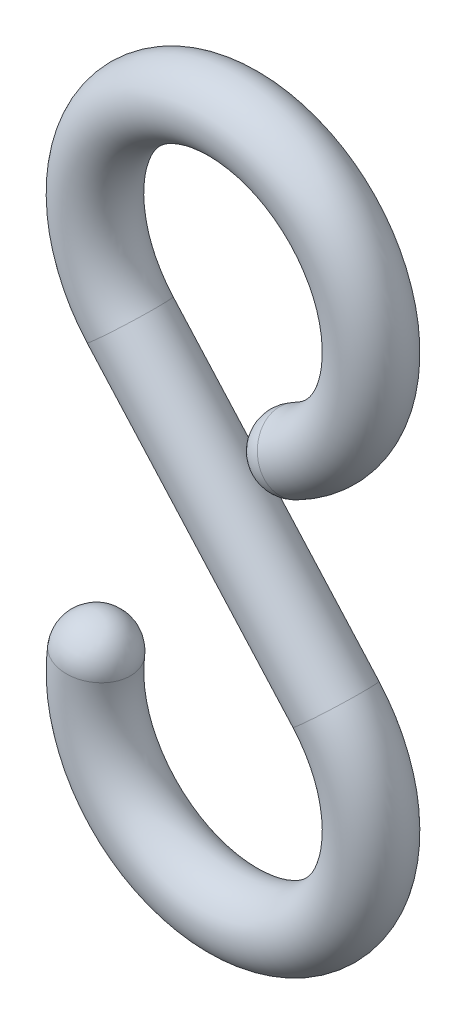
ISO-10303-21;
HEADER;
FILE_DESCRIPTION(('STEP AP214'),'2;1');
FILE_NAME('part.step','',(''),(''),'','','');
FILE_SCHEMA(('AUTOMOTIVE_DESIGN { 1 0 10303 214 1 1 1 1 }'));
ENDSEC;
DATA;
#1=APPLICATION_CONTEXT('core data for automotive mechanical design processes');
#2=APPLICATION_PROTOCOL_DEFINITION('international standard','automotive_design',2000,#1);
#3=PRODUCT_CONTEXT('',#1,'mechanical');
#4=PRODUCT('Part','Part','',(#3));
#5=PRODUCT_RELATED_PRODUCT_CATEGORY('part','',(#4));
#6=PRODUCT_DEFINITION_FORMATION('','',#4);
#7=PRODUCT_DEFINITION_CONTEXT('part definition',#1,'design');
#8=PRODUCT_DEFINITION('design','',#6,#7);
#9=PRODUCT_DEFINITION_SHAPE('','',#8);
#10=(LENGTH_UNIT() NAMED_UNIT(*) SI_UNIT(.MILLI.,.METRE.));
#11=(NAMED_UNIT(*) PLANE_ANGLE_UNIT() SI_UNIT($,.RADIAN.));
#12=(NAMED_UNIT(*) SI_UNIT($,.STERADIAN.) SOLID_ANGLE_UNIT());
#13=UNCERTAINTY_MEASURE_WITH_UNIT(LENGTH_MEASURE(1.E-05),#10,'distance_accuracy_value','');
#14=(GEOMETRIC_REPRESENTATION_CONTEXT(3) GLOBAL_UNCERTAINTY_ASSIGNED_CONTEXT((#13)) GLOBAL_UNIT_ASSIGNED_CONTEXT((#10,
#11,#12)) REPRESENTATION_CONTEXT('',''));
#15=CARTESIAN_POINT('',(0.,0.,0.));
#16=DIRECTION('',(0.,0.,1.));
#17=DIRECTION('',(1.,0.,0.));
#18=AXIS2_PLACEMENT_3D('',#15,#16,#17);
#19=CARTESIAN_POINT('',(-12.5858617436527,1.6988478947982,0.));
#20=DIRECTION('',(0.,0.,1.));
#21=DIRECTION('',(1.,0.,0.));
#22=AXIS2_PLACEMENT_3D('',#19,#20,#21);
#23=SPHERICAL_SURFACE('',#22,3.175);
#24=CARTESIAN_POINT('',(-12.5858617436527,1.6988478947982,0.));
#25=DIRECTION('',(0.133767550771511,0.991012735720682,0.));
#26=DIRECTION('',(-0.991012735720682,0.133767550771511,0.));
#27=AXIS2_PLACEMENT_3D('',#24,#25,#26);
#28=SPHERICAL_SURFACE('',#27,3.175);
#29=CARTESIAN_POINT('',(-12.5858617436527,1.6988478947982,0.));
#30=DIRECTION('',(0.133767550771511,0.991012735720682,0.));
#31=DIRECTION('',(-0.991012735720683,0.133767550771511,0.));
#32=AXIS2_PLACEMENT_3D('',#29,#30,#31);
#33=CIRCLE('',#32,3.175);
#34=CARTESIAN_POINT('',(-15.7323271795658,2.12355986849775,0.));
#35=VERTEX_POINT('',#34);
#36=EDGE_CURVE('E63',#35,#35,#33,.T.);
#37=ORIENTED_EDGE('',*,*,#36,.T.);
#38=EDGE_LOOP('',(#37));
#39=FACE_BOUND('',#38,.T.);
#40=ADVANCED_FACE('F47',(#39),#28,.T.);
#41=CARTESIAN_POINT('',(5.71981295424212,26.7609638959705,0.));
#42=DIRECTION('',(0.,0.,1.));
#43=DIRECTION('',(1.,0.,0.));
#44=AXIS2_PLACEMENT_3D('',#41,#42,#43);
#45=SPHERICAL_SURFACE('',#44,3.175);
#46=CARTESIAN_POINT('',(5.71981295424212,26.7609638959705,0.));
#47=DIRECTION('',(0.892837488506259,0.45037897277497,0.));
#48=DIRECTION('',(-0.45037897277497,0.892837488506258,0.));
#49=AXIS2_PLACEMENT_3D('',#46,#47,#48);
#50=SPHERICAL_SURFACE('',#49,3.175);
#51=CARTESIAN_POINT('',(5.71981295424212,26.7609638959705,0.));
#52=DIRECTION('',(0.892837488506258,0.45037897277497,0.));
#53=DIRECTION('',(-0.45037897277497,0.892837488506259,0.));
#54=AXIS2_PLACEMENT_3D('',#51,#52,#53);
#55=CIRCLE('',#54,3.175);
#56=CARTESIAN_POINT('',(7.14976619280265,23.9262048699632,0.));
#57=VERTEX_POINT('',#56);
#58=EDGE_CURVE('E11',#57,#57,#55,.T.);
#59=ORIENTED_EDGE('',*,*,#58,.F.);
#60=EDGE_LOOP('',(#59));
#61=FACE_BOUND('',#60,.T.);
#62=ADVANCED_FACE('F49',(#61),#50,.T.);
#63=CARTESIAN_POINT('',(0.,0.,0.));
#64=DIRECTION('',(0.,0.,1.));
#65=DIRECTION('',(1.,0.,0.));
#66=AXIS2_PLACEMENT_3D('',#63,#64,#65);
#67=TOROIDAL_SURFACE('',#66,12.7,3.175);
#68=CARTESIAN_POINT('',(9.46602110474912,8.46666666666667,0.));
#69=DIRECTION('',(0.666666666666666,-0.74535599249993,0.));
#70=DIRECTION('',(0.74535599249993,0.666666666666667,0.));
#71=AXIS2_PLACEMENT_3D('',#68,#69,#70);
#72=CIRCLE('',#71,3.175);
#73=CARTESIAN_POINT('',(11.8325263809364,10.5833333333333,0.));
#74=VERTEX_POINT('',#73);
#75=EDGE_CURVE('E58',#74,#74,#72,.T.);
#76=CARTESIAN_POINT('',(0.,0.,0.));
#77=DIRECTION('',(0.,0.,1.));
#78=DIRECTION('',(1.,0.,0.));
#79=AXIS2_PLACEMENT_3D('',#76,#77,#78);
#80=CIRCLE('',#79,15.875);
#81=EDGE_CURVE('',#35,#74,#80,.T.);
#82=ORIENTED_EDGE('',*,*,#36,.F.);
#83=ORIENTED_EDGE('',*,*,#75,.T.);
#84=ORIENTED_EDGE('',*,*,#81,.T.);
#85=ORIENTED_EDGE('',*,*,#81,.F.);
#86=EDGE_LOOP('',(#82,#84,#83,#85));
#87=FACE_BOUND('',#86,.T.);
#88=ADVANCED_FACE('F69',(#87),#67,.T.);
#89=CARTESIAN_POINT('',(9.46602110474911,8.46666666666667,0.));
#90=DIRECTION('',(-0.666666666666667,0.74535599249993,0.));
#91=DIRECTION('',(-0.74535599249993,-0.666666666666667,0.));
#92=AXIS2_PLACEMENT_3D('',#89,#90,#91);
#93=CYLINDRICAL_SURFACE('',#92,3.175);
#94=CARTESIAN_POINT('',(-9.4660211047491,29.6333333333333,0.));
#95=DIRECTION('',(0.666666666666666,-0.74535599249993,0.));
#96=DIRECTION('',(0.745355992499931,0.666666666666666,0.));
#97=AXIS2_PLACEMENT_3D('',#94,#95,#96);
#98=CIRCLE('',#97,3.175);
#99=CARTESIAN_POINT('',(-11.8325263809364,27.5166666666667,0.));
#100=VERTEX_POINT('',#99);
#101=EDGE_CURVE('E54',#100,#100,#98,.T.);
#102=ORIENTED_EDGE('',*,*,#101,.T.);
#103=EDGE_LOOP('',(#102));
#104=FACE_BOUND('',#103,.T.);
#105=ORIENTED_EDGE('',*,*,#75,.F.);
#106=EDGE_LOOP('',(#105));
#107=FACE_BOUND('',#106,.T.);
#108=ADVANCED_FACE('F71',(#104,#107),#93,.T.);
#109=CARTESIAN_POINT('',(0.,38.1,0.));
#110=DIRECTION('',(0.,0.,-1.));
#111=DIRECTION('',(-1.,0.,0.));
#112=AXIS2_PLACEMENT_3D('',#109,#110,#111);
#113=TOROIDAL_SURFACE('',#112,12.7,3.175);
#114=CARTESIAN_POINT('',(0.,38.1,0.));
#115=DIRECTION('',(0.,0.,-1.));
#116=DIRECTION('',(-1.,0.,0.));
#117=AXIS2_PLACEMENT_3D('',#114,#115,#116);
#118=CIRCLE('',#117,15.875);
#119=EDGE_CURVE('',#100,#57,#118,.T.);
#120=ORIENTED_EDGE('',*,*,#101,.F.);
#121=ORIENTED_EDGE('',*,*,#58,.T.);
#122=ORIENTED_EDGE('',*,*,#119,.T.);
#123=ORIENTED_EDGE('',*,*,#119,.F.);
#124=EDGE_LOOP('',(#120,#122,#121,#123));
#125=FACE_BOUND('',#124,.T.);
#126=ADVANCED_FACE('F78',(#125),#113,.T.);
#127=CLOSED_SHELL('',(#40,#62,#88,#108,#126));
#128=MANIFOLD_SOLID_BREP('B2',#127);
#129=ADVANCED_BREP_SHAPE_REPRESENTATION('',(#18,#128),#14);
#130=SHAPE_DEFINITION_REPRESENTATION(#9,#129);
ENDSEC;
END-ISO-10303-21;
